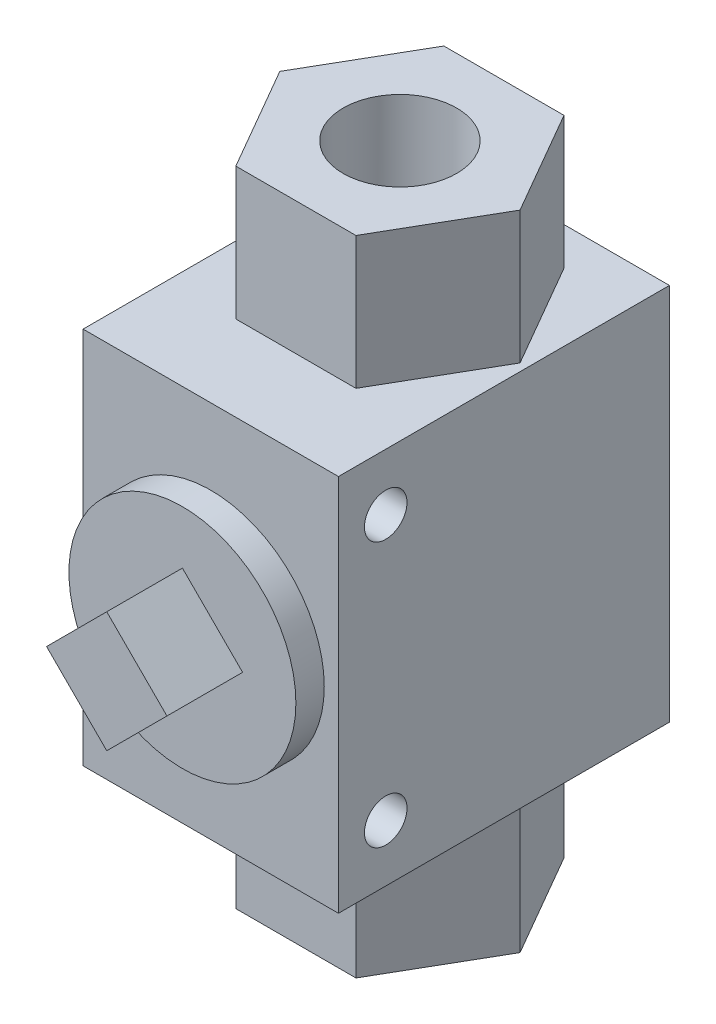
ISO-10303-21;
HEADER;
FILE_DESCRIPTION(('STEP AP214'),'2;1');
FILE_NAME('part.step','',(''),(''),'','','');
FILE_SCHEMA(('AUTOMOTIVE_DESIGN { 1 0 10303 214 1 1 1 1 }'));
ENDSEC;
DATA;
#1=APPLICATION_CONTEXT('core data for automotive mechanical design processes');
#2=APPLICATION_PROTOCOL_DEFINITION('international standard','automotive_design',2000,#1);
#3=PRODUCT_CONTEXT('',#1,'mechanical');
#4=PRODUCT('Part','Part','',(#3));
#5=PRODUCT_RELATED_PRODUCT_CATEGORY('part','',(#4));
#6=PRODUCT_DEFINITION_FORMATION('','',#4);
#7=PRODUCT_DEFINITION_CONTEXT('part definition',#1,'design');
#8=PRODUCT_DEFINITION('design','',#6,#7);
#9=PRODUCT_DEFINITION_SHAPE('','',#8);
#10=(LENGTH_UNIT() NAMED_UNIT(*) SI_UNIT(.MILLI.,.METRE.));
#11=(NAMED_UNIT(*) PLANE_ANGLE_UNIT() SI_UNIT($,.RADIAN.));
#12=(NAMED_UNIT(*) SI_UNIT($,.STERADIAN.) SOLID_ANGLE_UNIT());
#13=UNCERTAINTY_MEASURE_WITH_UNIT(LENGTH_MEASURE(1.E-05),#10,'distance_accuracy_value','');
#14=(GEOMETRIC_REPRESENTATION_CONTEXT(3) GLOBAL_UNCERTAINTY_ASSIGNED_CONTEXT((#13)) GLOBAL_UNIT_ASSIGNED_CONTEXT((#10,
#11,#12)) REPRESENTATION_CONTEXT('',''));
#15=CARTESIAN_POINT('',(0.,0.,0.));
#16=DIRECTION('',(0.,0.,1.));
#17=DIRECTION('',(1.,0.,0.));
#18=AXIS2_PLACEMENT_3D('',#15,#16,#17);
#19=CARTESIAN_POINT('',(27.,0.,0.));
#20=DIRECTION('',(-1.,0.,0.));
#21=DIRECTION('',(0.,0.,1.));
#22=AXIS2_PLACEMENT_3D('',#19,#20,#21);
#23=PLANE('',#22);
#24=DIRECTION('',(0.,0.,1.));
#25=VECTOR('',#24,1.);
#26=CARTESIAN_POINT('',(27.,20.,-17.5));
#27=LINE('',#26,#25);
#28=CARTESIAN_POINT('',(27.,20.,-17.5));
#29=VERTEX_POINT('',#28);
#30=CARTESIAN_POINT('',(27.,20.,17.5));
#31=VERTEX_POINT('',#30);
#32=EDGE_CURVE('E347',#29,#31,#27,.T.);
#33=ORIENTED_EDGE('',*,*,#32,.T.);
#34=DIRECTION('',(0.,-1.,0.));
#35=VECTOR('',#34,1.);
#36=CARTESIAN_POINT('',(27.,-20.,17.5));
#37=LINE('',#36,#35);
#38=CARTESIAN_POINT('',(27.,-20.,17.5));
#39=VERTEX_POINT('',#38);
#40=EDGE_CURVE('E351',#31,#39,#37,.T.);
#41=ORIENTED_EDGE('',*,*,#40,.T.);
#42=DIRECTION('',(0.,0.,-1.));
#43=VECTOR('',#42,1.);
#44=CARTESIAN_POINT('',(27.,-20.,-17.5));
#45=LINE('',#44,#43);
#46=CARTESIAN_POINT('',(27.,-20.,-17.5));
#47=VERTEX_POINT('',#46);
#48=EDGE_CURVE('E355',#39,#47,#45,.T.);
#49=ORIENTED_EDGE('',*,*,#48,.T.);
#50=DIRECTION('',(0.,1.,0.));
#51=VECTOR('',#50,1.);
#52=CARTESIAN_POINT('',(27.,-20.,-17.5));
#53=LINE('',#52,#51);
#54=EDGE_CURVE('E358',#47,#29,#53,.T.);
#55=ORIENTED_EDGE('',*,*,#54,.T.);
#56=EDGE_LOOP('',(#33,#41,#49,#55));
#57=FACE_BOUND('',#56,.T.);
#58=CARTESIAN_POINT('',(27.,-14.,12.5));
#59=DIRECTION('',(1.,0.,0.));
#60=DIRECTION('',(0.,0.,-1.));
#61=AXIS2_PLACEMENT_3D('',#58,#59,#60);
#62=CIRCLE('',#61,2.25);
#63=CARTESIAN_POINT('',(27.,-14.,10.25));
#64=VERTEX_POINT('',#63);
#65=EDGE_CURVE('E339',#64,#64,#62,.T.);
#66=ORIENTED_EDGE('',*,*,#65,.F.);
#67=EDGE_LOOP('',(#66));
#68=FACE_BOUND('',#67,.T.);
#69=CARTESIAN_POINT('',(27.,14.,12.5));
#70=DIRECTION('',(1.,0.,0.));
#71=DIRECTION('',(0.,0.,-1.));
#72=AXIS2_PLACEMENT_3D('',#69,#70,#71);
#73=CIRCLE('',#72,2.25);
#74=CARTESIAN_POINT('',(27.,14.,10.25));
#75=VERTEX_POINT('',#74);
#76=EDGE_CURVE('E331',#75,#75,#73,.T.);
#77=ORIENTED_EDGE('',*,*,#76,.F.);
#78=EDGE_LOOP('',(#77));
#79=FACE_BOUND('',#78,.T.);
#80=ADVANCED_FACE('F45',(#57,#68,#79),#23,.F.);
#81=CARTESIAN_POINT('',(0.,0.,0.));
#82=DIRECTION('',(-1.,0.,0.));
#83=DIRECTION('',(0.,0.,1.));
#84=AXIS2_PLACEMENT_3D('',#81,#82,#83);
#85=PLANE('',#84);
#86=CARTESIAN_POINT('',(0.,-14.,12.5));
#87=DIRECTION('',(1.,0.,0.));
#88=DIRECTION('',(0.,0.,-1.));
#89=AXIS2_PLACEMENT_3D('',#86,#87,#88);
#90=CIRCLE('',#89,2.25);
#91=CARTESIAN_POINT('',(0.,-14.,10.25));
#92=VERTEX_POINT('',#91);
#93=EDGE_CURVE('E335',#92,#92,#90,.T.);
#94=ORIENTED_EDGE('',*,*,#93,.T.);
#95=EDGE_LOOP('',(#94));
#96=FACE_BOUND('',#95,.T.);
#97=DIRECTION('',(0.,0.,1.));
#98=VECTOR('',#97,1.);
#99=CARTESIAN_POINT('',(0.,20.,-17.5));
#100=LINE('',#99,#98);
#101=CARTESIAN_POINT('',(0.,20.,-17.5));
#102=VERTEX_POINT('',#101);
#103=CARTESIAN_POINT('',(0.,20.,17.5));
#104=VERTEX_POINT('',#103);
#105=EDGE_CURVE('E343',#102,#104,#100,.T.);
#106=ORIENTED_EDGE('',*,*,#105,.F.);
#107=DIRECTION('',(0.,1.,0.));
#108=VECTOR('',#107,1.);
#109=CARTESIAN_POINT('',(0.,-20.,-17.5));
#110=LINE('',#109,#108);
#111=CARTESIAN_POINT('',(0.,-20.,-17.5));
#112=VERTEX_POINT('',#111);
#113=EDGE_CURVE('E352',#112,#102,#110,.T.);
#114=ORIENTED_EDGE('',*,*,#113,.F.);
#115=DIRECTION('',(0.,0.,-1.));
#116=VECTOR('',#115,1.);
#117=CARTESIAN_POINT('',(0.,-20.,-17.5));
#118=LINE('',#117,#116);
#119=CARTESIAN_POINT('',(0.,-20.,17.5));
#120=VERTEX_POINT('',#119);
#121=EDGE_CURVE('E368',#120,#112,#118,.T.);
#122=ORIENTED_EDGE('',*,*,#121,.F.);
#123=DIRECTION('',(0.,-1.,0.));
#124=VECTOR('',#123,1.);
#125=CARTESIAN_POINT('',(0.,-20.,17.5));
#126=LINE('',#125,#124);
#127=EDGE_CURVE('E365',#104,#120,#126,.T.);
#128=ORIENTED_EDGE('',*,*,#127,.F.);
#129=EDGE_LOOP('',(#106,#114,#122,#128));
#130=FACE_BOUND('',#129,.T.);
#131=CARTESIAN_POINT('',(0.,14.,12.5));
#132=DIRECTION('',(1.,0.,0.));
#133=DIRECTION('',(0.,0.,-1.));
#134=AXIS2_PLACEMENT_3D('',#131,#132,#133);
#135=CIRCLE('',#134,2.25);
#136=CARTESIAN_POINT('',(0.,14.,10.25));
#137=VERTEX_POINT('',#136);
#138=EDGE_CURVE('E330',#137,#137,#135,.T.);
#139=ORIENTED_EDGE('',*,*,#138,.T.);
#140=EDGE_LOOP('',(#139));
#141=FACE_BOUND('',#140,.T.);
#142=ADVANCED_FACE('F450',(#96,#130,#141),#85,.T.);
#143=CARTESIAN_POINT('',(27.,20.,-17.5));
#144=DIRECTION('',(0.,-1.,0.));
#145=DIRECTION('',(0.,0.,-1.));
#146=AXIS2_PLACEMENT_3D('',#143,#144,#145);
#147=PLANE('',#146);
#148=DIRECTION('',(-0.5,0.,-0.866025403784439));
#149=VECTOR('',#148,1.);
#150=CARTESIAN_POINT('',(0.853530029987878,20.,-2.40432852445504));
#151=LINE('',#150,#149);
#152=CARTESIAN_POINT('',(7.14914703891411,20.,8.5));
#153=VERTEX_POINT('',#152);
#154=CARTESIAN_POINT('',(0.798294077828228,20.,-2.5));
#155=VERTEX_POINT('',#154);
#156=EDGE_CURVE('E279',#153,#155,#151,.T.);
#157=ORIENTED_EDGE('',*,*,#156,.T.);
#158=DIRECTION('',(0.5,0.,-0.866025403784439));
#159=VECTOR('',#158,1.);
#160=CARTESIAN_POINT('',(13.8439110867545,20.,-25.095671475545));
#161=LINE('',#160,#159);
#162=CARTESIAN_POINT('',(7.14914703891412,20.,-13.5));
#163=VERTEX_POINT('',#162);
#164=EDGE_CURVE('E326',#155,#163,#161,.T.);
#165=ORIENTED_EDGE('',*,*,#164,.T.);
#166=DIRECTION('',(1.,0.,0.));
#167=VECTOR('',#166,1.);
#168=CARTESIAN_POINT('',(27.,20.,-13.5));
#169=LINE('',#168,#167);
#170=CARTESIAN_POINT('',(19.8508529610859,20.,-13.5));
#171=VERTEX_POINT('',#170);
#172=EDGE_CURVE('E322',#163,#171,#169,.T.);
#173=ORIENTED_EDGE('',*,*,#172,.T.);
#174=DIRECTION('',(0.5,0.,0.866025403784439));
#175=VECTOR('',#174,1.);
#176=CARTESIAN_POINT('',(19.9060889132455,20.,-13.404328524455));
#177=LINE('',#176,#175);
#178=CARTESIAN_POINT('',(26.2017059221718,20.,-2.5));
#179=VERTEX_POINT('',#178);
#180=EDGE_CURVE('E318',#171,#179,#177,.T.);
#181=ORIENTED_EDGE('',*,*,#180,.T.);
#182=DIRECTION('',(-0.5,0.,0.866025403784439));
#183=VECTOR('',#182,1.);
#184=CARTESIAN_POINT('',(32.8964699700121,20.,-14.095671475545));
#185=LINE('',#184,#183);
#186=CARTESIAN_POINT('',(19.8508529610859,20.,8.5));
#187=VERTEX_POINT('',#186);
#188=EDGE_CURVE('E314',#179,#187,#185,.T.);
#189=ORIENTED_EDGE('',*,*,#188,.T.);
#190=DIRECTION('',(-1.,0.,0.));
#191=VECTOR('',#190,1.);
#192=CARTESIAN_POINT('',(27.,20.,8.5));
#193=LINE('',#192,#191);
#194=EDGE_CURVE('E310',#187,#153,#193,.T.);
#195=ORIENTED_EDGE('',*,*,#194,.T.);
#196=EDGE_LOOP('',(#157,#165,#173,#181,#189,#195));
#197=FACE_BOUND('',#196,.T.);
#198=ORIENTED_EDGE('',*,*,#105,.T.);
#199=DIRECTION('',(-1.,0.,0.));
#200=VECTOR('',#199,1.);
#201=CARTESIAN_POINT('',(27.,20.,17.5));
#202=LINE('',#201,#200);
#203=EDGE_CURVE('E384',#31,#104,#202,.T.);
#204=ORIENTED_EDGE('',*,*,#203,.F.);
#205=ORIENTED_EDGE('',*,*,#32,.F.);
#206=DIRECTION('',(-1.,0.,0.));
#207=VECTOR('',#206,1.);
#208=CARTESIAN_POINT('',(27.,20.,-17.5));
#209=LINE('',#208,#207);
#210=EDGE_CURVE('E361',#29,#102,#209,.T.);
#211=ORIENTED_EDGE('',*,*,#210,.T.);
#212=EDGE_LOOP('',(#198,#204,#205,#211));
#213=FACE_BOUND('',#212,.T.);
#214=ADVANCED_FACE('F47',(#197,#213),#147,.F.);
#215=CARTESIAN_POINT('',(27.,-20.,17.5));
#216=DIRECTION('',(0.,0.,-1.));
#217=DIRECTION('',(-1.,0.,0.));
#218=AXIS2_PLACEMENT_3D('',#215,#216,#217);
#219=PLANE('',#218);
#220=CARTESIAN_POINT('',(13.5,0.,17.5));
#221=DIRECTION('',(0.,0.,1.));
#222=DIRECTION('',(1.,0.,0.));
#223=AXIS2_PLACEMENT_3D('',#220,#221,#222);
#224=CIRCLE('',#223,12.);
#225=CARTESIAN_POINT('',(25.5,0.,17.5));
#226=VERTEX_POINT('',#225);
#227=EDGE_CURVE('E11',#226,#226,#224,.T.);
#228=ORIENTED_EDGE('',*,*,#227,.F.);
#229=EDGE_LOOP('',(#228));
#230=FACE_BOUND('',#229,.T.);
#231=ORIENTED_EDGE('',*,*,#127,.T.);
#232=DIRECTION('',(-1.,0.,0.));
#233=VECTOR('',#232,1.);
#234=CARTESIAN_POINT('',(27.,-20.,17.5));
#235=LINE('',#234,#233);
#236=EDGE_CURVE('E380',#39,#120,#235,.T.);
#237=ORIENTED_EDGE('',*,*,#236,.F.);
#238=ORIENTED_EDGE('',*,*,#40,.F.);
#239=ORIENTED_EDGE('',*,*,#203,.T.);
#240=EDGE_LOOP('',(#231,#237,#238,#239));
#241=FACE_BOUND('',#240,.T.);
#242=ADVANCED_FACE('F468',(#230,#241),#219,.F.);
#243=CARTESIAN_POINT('',(27.,-20.,-17.5));
#244=DIRECTION('',(0.,1.,0.));
#245=DIRECTION('',(0.,0.,1.));
#246=AXIS2_PLACEMENT_3D('',#243,#244,#245);
#247=PLANE('',#246);
#248=DIRECTION('',(-1.,0.,0.));
#249=VECTOR('',#248,1.);
#250=CARTESIAN_POINT('',(27.,-20.,-13.5));
#251=LINE('',#250,#249);
#252=CARTESIAN_POINT('',(19.8508529610859,-20.,-13.5));
#253=VERTEX_POINT('',#252);
#254=CARTESIAN_POINT('',(7.14914703891412,-20.,-13.5));
#255=VERTEX_POINT('',#254);
#256=EDGE_CURVE('E407',#253,#255,#251,.T.);
#257=ORIENTED_EDGE('',*,*,#256,.T.);
#258=DIRECTION('',(-0.5,0.,0.866025403784439));
#259=VECTOR('',#258,1.);
#260=CARTESIAN_POINT('',(13.8439110867545,-20.,-25.095671475545));
#261=LINE('',#260,#259);
#262=CARTESIAN_POINT('',(0.798294077828233,-20.,-2.5));
#263=VERTEX_POINT('',#262);
#264=EDGE_CURVE('E49',#255,#263,#261,.T.);
#265=ORIENTED_EDGE('',*,*,#264,.T.);
#266=DIRECTION('',(0.5,0.,0.866025403784439));
#267=VECTOR('',#266,1.);
#268=CARTESIAN_POINT('',(0.853530029987878,-20.,-2.40432852445504));
#269=LINE('',#268,#267);
#270=CARTESIAN_POINT('',(7.14914703891411,-20.,8.5));
#271=VERTEX_POINT('',#270);
#272=EDGE_CURVE('E392',#263,#271,#269,.T.);
#273=ORIENTED_EDGE('',*,*,#272,.T.);
#274=DIRECTION('',(1.,0.,0.));
#275=VECTOR('',#274,1.);
#276=CARTESIAN_POINT('',(27.,-20.,8.5));
#277=LINE('',#276,#275);
#278=CARTESIAN_POINT('',(19.8508529610859,-20.,8.5));
#279=VERTEX_POINT('',#278);
#280=EDGE_CURVE('E396',#271,#279,#277,.T.);
#281=ORIENTED_EDGE('',*,*,#280,.T.);
#282=DIRECTION('',(0.5,0.,-0.866025403784439));
#283=VECTOR('',#282,1.);
#284=CARTESIAN_POINT('',(32.8964699700121,-20.,-14.095671475545));
#285=LINE('',#284,#283);
#286=CARTESIAN_POINT('',(26.2017059221718,-20.,-2.5));
#287=VERTEX_POINT('',#286);
#288=EDGE_CURVE('E400',#279,#287,#285,.T.);
#289=ORIENTED_EDGE('',*,*,#288,.T.);
#290=DIRECTION('',(-0.5,0.,-0.866025403784439));
#291=VECTOR('',#290,1.);
#292=CARTESIAN_POINT('',(19.9060889132455,-20.,-13.404328524455));
#293=LINE('',#292,#291);
#294=EDGE_CURVE('E404',#287,#253,#293,.T.);
#295=ORIENTED_EDGE('',*,*,#294,.T.);
#296=EDGE_LOOP('',(#257,#265,#273,#281,#289,#295));
#297=FACE_BOUND('',#296,.T.);
#298=ORIENTED_EDGE('',*,*,#121,.T.);
#299=DIRECTION('',(-1.,0.,0.));
#300=VECTOR('',#299,1.);
#301=CARTESIAN_POINT('',(27.,-20.,-17.5));
#302=LINE('',#301,#300);
#303=EDGE_CURVE('E376',#47,#112,#302,.T.);
#304=ORIENTED_EDGE('',*,*,#303,.F.);
#305=ORIENTED_EDGE('',*,*,#48,.F.);
#306=ORIENTED_EDGE('',*,*,#236,.T.);
#307=EDGE_LOOP('',(#298,#304,#305,#306));
#308=FACE_BOUND('',#307,.T.);
#309=ADVANCED_FACE('F413',(#297,#308),#247,.F.);
#310=CARTESIAN_POINT('',(27.,-20.,-17.5));
#311=DIRECTION('',(0.,0.,1.));
#312=DIRECTION('',(1.,0.,0.));
#313=AXIS2_PLACEMENT_3D('',#310,#311,#312);
#314=PLANE('',#313);
#315=ORIENTED_EDGE('',*,*,#113,.T.);
#316=ORIENTED_EDGE('',*,*,#210,.F.);
#317=ORIENTED_EDGE('',*,*,#54,.F.);
#318=ORIENTED_EDGE('',*,*,#303,.T.);
#319=EDGE_LOOP('',(#315,#316,#317,#318));
#320=FACE_BOUND('',#319,.T.);
#321=ADVANCED_FACE('F463',(#320),#314,.F.);
#322=CARTESIAN_POINT('',(27.,-14.,12.5));
#323=DIRECTION('',(-1.,0.,0.));
#324=DIRECTION('',(0.,0.,1.));
#325=AXIS2_PLACEMENT_3D('',#322,#323,#324);
#326=CYLINDRICAL_SURFACE('',#325,2.25);
#327=ORIENTED_EDGE('',*,*,#65,.T.);
#328=EDGE_LOOP('',(#327));
#329=FACE_BOUND('',#328,.T.);
#330=ORIENTED_EDGE('',*,*,#93,.F.);
#331=EDGE_LOOP('',(#330));
#332=FACE_BOUND('',#331,.T.);
#333=ADVANCED_FACE('F460',(#329,#332),#326,.F.);
#334=CARTESIAN_POINT('',(27.,14.,12.5));
#335=DIRECTION('',(-1.,0.,0.));
#336=DIRECTION('',(0.,0.,1.));
#337=AXIS2_PLACEMENT_3D('',#334,#335,#336);
#338=CYLINDRICAL_SURFACE('',#337,2.25);
#339=ORIENTED_EDGE('',*,*,#76,.T.);
#340=EDGE_LOOP('',(#339));
#341=FACE_BOUND('',#340,.T.);
#342=ORIENTED_EDGE('',*,*,#138,.F.);
#343=EDGE_LOOP('',(#342));
#344=FACE_BOUND('',#343,.T.);
#345=ADVANCED_FACE('F496',(#341,#344),#338,.F.);
#346=CARTESIAN_POINT('',(0.798294077828233,-34.,-2.5));
#347=DIRECTION('',(-0.866025403784439,0.,0.5));
#348=DIRECTION('',(0.5,0.,0.866025403784439));
#349=AXIS2_PLACEMENT_3D('',#346,#347,#348);
#350=PLANE('',#349);
#351=ORIENTED_EDGE('',*,*,#272,.F.);
#352=DIRECTION('',(0.,1.,0.));
#353=VECTOR('',#352,1.);
#354=CARTESIAN_POINT('',(0.798294077828233,-34.,-2.5));
#355=LINE('',#354,#353);
#356=CARTESIAN_POINT('',(0.798294077828233,-34.,-2.5));
#357=VERTEX_POINT('',#356);
#358=EDGE_CURVE('E300',#357,#263,#355,.T.);
#359=ORIENTED_EDGE('',*,*,#358,.F.);
#360=DIRECTION('',(0.5,0.,0.866025403784439));
#361=VECTOR('',#360,1.);
#362=CARTESIAN_POINT('',(0.798294077828233,-34.,-2.5));
#363=LINE('',#362,#361);
#364=CARTESIAN_POINT('',(7.14914703891411,-34.,8.5));
#365=VERTEX_POINT('',#364);
#366=EDGE_CURVE('E254',#357,#365,#363,.T.);
#367=ORIENTED_EDGE('',*,*,#366,.T.);
#368=DIRECTION('',(0.,1.,0.));
#369=VECTOR('',#368,1.);
#370=CARTESIAN_POINT('',(7.14914703891411,-34.,8.5));
#371=LINE('',#370,#369);
#372=EDGE_CURVE('E296',#365,#271,#371,.T.);
#373=ORIENTED_EDGE('',*,*,#372,.T.);
#374=EDGE_LOOP('',(#351,#359,#367,#373));
#375=FACE_BOUND('',#374,.T.);
#376=ADVANCED_FACE('F428',(#375),#350,.T.);
#377=CARTESIAN_POINT('',(7.14914703891411,-34.,8.5));
#378=DIRECTION('',(0.,0.,1.));
#379=DIRECTION('',(1.,0.,0.));
#380=AXIS2_PLACEMENT_3D('',#377,#378,#379);
#381=PLANE('',#380);
#382=ORIENTED_EDGE('',*,*,#280,.F.);
#383=ORIENTED_EDGE('',*,*,#372,.F.);
#384=DIRECTION('',(1.,0.,0.));
#385=VECTOR('',#384,1.);
#386=CARTESIAN_POINT('',(7.14914703891411,-34.,8.5));
#387=LINE('',#386,#385);
#388=CARTESIAN_POINT('',(19.8508529610859,-34.,8.5));
#389=VERTEX_POINT('',#388);
#390=EDGE_CURVE('E258',#365,#389,#387,.T.);
#391=ORIENTED_EDGE('',*,*,#390,.T.);
#392=DIRECTION('',(0.,1.,0.));
#393=VECTOR('',#392,1.);
#394=CARTESIAN_POINT('',(19.8508529610859,-34.,8.5));
#395=LINE('',#394,#393);
#396=EDGE_CURVE('E291',#389,#279,#395,.T.);
#397=ORIENTED_EDGE('',*,*,#396,.T.);
#398=EDGE_LOOP('',(#382,#383,#391,#397));
#399=FACE_BOUND('',#398,.T.);
#400=ADVANCED_FACE('F431',(#399),#381,.T.);
#401=CARTESIAN_POINT('',(19.8508529610859,-34.,8.5));
#402=DIRECTION('',(0.866025403784439,0.,0.5));
#403=DIRECTION('',(0.5,0.,-0.866025403784439));
#404=AXIS2_PLACEMENT_3D('',#401,#402,#403);
#405=PLANE('',#404);
#406=ORIENTED_EDGE('',*,*,#288,.F.);
#407=ORIENTED_EDGE('',*,*,#396,.F.);
#408=DIRECTION('',(0.5,0.,-0.866025403784439));
#409=VECTOR('',#408,1.);
#410=CARTESIAN_POINT('',(19.8508529610859,-34.,8.5));
#411=LINE('',#410,#409);
#412=CARTESIAN_POINT('',(26.2017059221718,-34.,-2.5));
#413=VERTEX_POINT('',#412);
#414=EDGE_CURVE('E262',#389,#413,#411,.T.);
#415=ORIENTED_EDGE('',*,*,#414,.T.);
#416=DIRECTION('',(0.,1.,0.));
#417=VECTOR('',#416,1.);
#418=CARTESIAN_POINT('',(26.2017059221718,-34.,-2.5));
#419=LINE('',#418,#417);
#420=EDGE_CURVE('E286',#413,#287,#419,.T.);
#421=ORIENTED_EDGE('',*,*,#420,.T.);
#422=EDGE_LOOP('',(#406,#407,#415,#421));
#423=FACE_BOUND('',#422,.T.);
#424=ADVANCED_FACE('F433',(#423),#405,.T.);
#425=CARTESIAN_POINT('',(26.2017059221718,-34.,-2.5));
#426=DIRECTION('',(0.866025403784439,0.,-0.5));
#427=DIRECTION('',(-0.5,0.,-0.866025403784439));
#428=AXIS2_PLACEMENT_3D('',#425,#426,#427);
#429=PLANE('',#428);
#430=ORIENTED_EDGE('',*,*,#294,.F.);
#431=ORIENTED_EDGE('',*,*,#420,.F.);
#432=DIRECTION('',(-0.5,0.,-0.866025403784439));
#433=VECTOR('',#432,1.);
#434=CARTESIAN_POINT('',(26.2017059221718,-34.,-2.5));
#435=LINE('',#434,#433);
#436=CARTESIAN_POINT('',(19.8508529610859,-34.,-13.5));
#437=VERTEX_POINT('',#436);
#438=EDGE_CURVE('E266',#413,#437,#435,.T.);
#439=ORIENTED_EDGE('',*,*,#438,.T.);
#440=DIRECTION('',(0.,1.,0.));
#441=VECTOR('',#440,1.);
#442=CARTESIAN_POINT('',(19.8508529610859,-34.,-13.5));
#443=LINE('',#442,#441);
#444=EDGE_CURVE('E281',#437,#253,#443,.T.);
#445=ORIENTED_EDGE('',*,*,#444,.T.);
#446=EDGE_LOOP('',(#430,#431,#439,#445));
#447=FACE_BOUND('',#446,.T.);
#448=ADVANCED_FACE('F435',(#447),#429,.T.);
#449=CARTESIAN_POINT('',(19.8508529610859,-34.,-13.5));
#450=DIRECTION('',(0.,0.,-1.));
#451=DIRECTION('',(-1.,0.,0.));
#452=AXIS2_PLACEMENT_3D('',#449,#450,#451);
#453=PLANE('',#452);
#454=ORIENTED_EDGE('',*,*,#256,.F.);
#455=ORIENTED_EDGE('',*,*,#444,.F.);
#456=DIRECTION('',(-1.,0.,0.));
#457=VECTOR('',#456,1.);
#458=CARTESIAN_POINT('',(19.8508529610859,-34.,-13.5));
#459=LINE('',#458,#457);
#460=CARTESIAN_POINT('',(7.14914703891412,-34.,-13.5));
#461=VERTEX_POINT('',#460);
#462=EDGE_CURVE('E270',#437,#461,#459,.T.);
#463=ORIENTED_EDGE('',*,*,#462,.T.);
#464=DIRECTION('',(0.,1.,0.));
#465=VECTOR('',#464,1.);
#466=CARTESIAN_POINT('',(7.14914703891412,-34.,-13.5));
#467=LINE('',#466,#465);
#468=EDGE_CURVE('E275',#461,#255,#467,.T.);
#469=ORIENTED_EDGE('',*,*,#468,.T.);
#470=EDGE_LOOP('',(#454,#455,#463,#469));
#471=FACE_BOUND('',#470,.T.);
#472=ADVANCED_FACE('F419',(#471),#453,.T.);
#473=CARTESIAN_POINT('',(7.14914703891412,-34.,-13.5));
#474=DIRECTION('',(-0.866025403784439,0.,-0.5));
#475=DIRECTION('',(-0.5,0.,0.866025403784439));
#476=AXIS2_PLACEMENT_3D('',#473,#474,#475);
#477=PLANE('',#476);
#478=ORIENTED_EDGE('',*,*,#264,.F.);
#479=ORIENTED_EDGE('',*,*,#468,.F.);
#480=DIRECTION('',(-0.5,0.,0.866025403784439));
#481=VECTOR('',#480,1.);
#482=CARTESIAN_POINT('',(7.14914703891412,-34.,-13.5));
#483=LINE('',#482,#481);
#484=EDGE_CURVE('E250',#461,#357,#483,.T.);
#485=ORIENTED_EDGE('',*,*,#484,.T.);
#486=ORIENTED_EDGE('',*,*,#358,.T.);
#487=EDGE_LOOP('',(#478,#479,#485,#486));
#488=FACE_BOUND('',#487,.T.);
#489=ADVANCED_FACE('F416',(#488),#477,.T.);
#490=CARTESIAN_POINT('',(0.,-34.,0.));
#491=DIRECTION('',(0.,1.,0.));
#492=DIRECTION('',(0.,0.,1.));
#493=AXIS2_PLACEMENT_3D('',#490,#491,#492);
#494=PLANE('',#493);
#495=CARTESIAN_POINT('',(13.5,-34.,-2.5));
#496=DIRECTION('',(0.,1.,0.));
#497=DIRECTION('',(0.,0.,1.));
#498=AXIS2_PLACEMENT_3D('',#495,#496,#497);
#499=CIRCLE('',#498,6.);
#500=CARTESIAN_POINT('',(13.5,-34.,3.5));
#501=VERTEX_POINT('',#500);
#502=EDGE_CURVE('E246',#501,#501,#499,.T.);
#503=ORIENTED_EDGE('',*,*,#502,.T.);
#504=EDGE_LOOP('',(#503));
#505=FACE_BOUND('',#504,.T.);
#506=ORIENTED_EDGE('',*,*,#484,.F.);
#507=ORIENTED_EDGE('',*,*,#462,.F.);
#508=ORIENTED_EDGE('',*,*,#438,.F.);
#509=ORIENTED_EDGE('',*,*,#414,.F.);
#510=ORIENTED_EDGE('',*,*,#390,.F.);
#511=ORIENTED_EDGE('',*,*,#366,.F.);
#512=EDGE_LOOP('',(#506,#507,#508,#509,#510,#511));
#513=FACE_BOUND('',#512,.T.);
#514=ADVANCED_FACE('F423',(#505,#513),#494,.F.);
#515=CARTESIAN_POINT('',(13.5,-34.,-2.5));
#516=DIRECTION('',(0.,1.,0.));
#517=DIRECTION('',(0.,0.,1.));
#518=AXIS2_PLACEMENT_3D('',#515,#516,#517);
#519=CYLINDRICAL_SURFACE('',#518,6.);
#520=ORIENTED_EDGE('',*,*,#502,.F.);
#521=EDGE_LOOP('',(#520));
#522=FACE_BOUND('',#521,.T.);
#523=CARTESIAN_POINT('',(13.5,-20.,-2.5));
#524=DIRECTION('',(0.,1.,0.));
#525=DIRECTION('',(0.,0.,1.));
#526=AXIS2_PLACEMENT_3D('',#523,#524,#525);
#527=CIRCLE('',#526,6.);
#528=CARTESIAN_POINT('',(13.5,-20.,3.5));
#529=VERTEX_POINT('',#528);
#530=EDGE_CURVE('E388',#529,#529,#527,.T.);
#531=ORIENTED_EDGE('',*,*,#530,.T.);
#532=EDGE_LOOP('',(#531));
#533=FACE_BOUND('',#532,.T.);
#534=ADVANCED_FACE('F550',(#522,#533),#519,.F.);
#535=ORIENTED_EDGE('',*,*,#530,.F.);
#536=EDGE_LOOP('',(#535));
#537=FACE_BOUND('',#536,.T.);
#538=ADVANCED_FACE('F469',(#537),#247,.F.);
#539=ORIENTED_EDGE('',*,*,#164,.F.);
#540=CARTESIAN_POINT('',(0.798294077828233,34.,-2.5));
#541=VERTEX_POINT('',#540);
#542=EDGE_CURVE('E274',#155,#541,#355,.T.);
#543=ORIENTED_EDGE('',*,*,#542,.T.);
#544=DIRECTION('',(-0.5,0.,0.866025403784439));
#545=VECTOR('',#544,1.);
#546=CARTESIAN_POINT('',(7.14914703891412,34.,-13.5));
#547=LINE('',#546,#545);
#548=CARTESIAN_POINT('',(7.14914703891412,34.,-13.5));
#549=VERTEX_POINT('',#548);
#550=EDGE_CURVE('E222',#549,#541,#547,.T.);
#551=ORIENTED_EDGE('',*,*,#550,.F.);
#552=EDGE_CURVE('E280',#163,#549,#467,.T.);
#553=ORIENTED_EDGE('',*,*,#552,.F.);
#554=EDGE_LOOP('',(#539,#543,#551,#553));
#555=FACE_BOUND('',#554,.T.);
#556=ADVANCED_FACE('F507',(#555),#477,.T.);
#557=ORIENTED_EDGE('',*,*,#172,.F.);
#558=ORIENTED_EDGE('',*,*,#552,.T.);
#559=DIRECTION('',(-1.,0.,0.));
#560=VECTOR('',#559,1.);
#561=CARTESIAN_POINT('',(19.8508529610859,34.,-13.5));
#562=LINE('',#561,#560);
#563=CARTESIAN_POINT('',(19.8508529610859,34.,-13.5));
#564=VERTEX_POINT('',#563);
#565=EDGE_CURVE('E242',#564,#549,#562,.T.);
#566=ORIENTED_EDGE('',*,*,#565,.F.);
#567=EDGE_CURVE('E285',#171,#564,#443,.T.);
#568=ORIENTED_EDGE('',*,*,#567,.F.);
#569=EDGE_LOOP('',(#557,#558,#566,#568));
#570=FACE_BOUND('',#569,.T.);
#571=ADVANCED_FACE('F444',(#570),#453,.T.);
#572=ORIENTED_EDGE('',*,*,#180,.F.);
#573=ORIENTED_EDGE('',*,*,#567,.T.);
#574=DIRECTION('',(-0.5,0.,-0.866025403784439));
#575=VECTOR('',#574,1.);
#576=CARTESIAN_POINT('',(26.2017059221718,34.,-2.5));
#577=LINE('',#576,#575);
#578=CARTESIAN_POINT('',(26.2017059221718,34.,-2.5));
#579=VERTEX_POINT('',#578);
#580=EDGE_CURVE('E238',#579,#564,#577,.T.);
#581=ORIENTED_EDGE('',*,*,#580,.F.);
#582=EDGE_CURVE('E290',#179,#579,#419,.T.);
#583=ORIENTED_EDGE('',*,*,#582,.F.);
#584=EDGE_LOOP('',(#572,#573,#581,#583));
#585=FACE_BOUND('',#584,.T.);
#586=ADVANCED_FACE('F438',(#585),#429,.T.);
#587=ORIENTED_EDGE('',*,*,#188,.F.);
#588=ORIENTED_EDGE('',*,*,#582,.T.);
#589=DIRECTION('',(0.5,0.,-0.866025403784439));
#590=VECTOR('',#589,1.);
#591=CARTESIAN_POINT('',(19.8508529610859,34.,8.5));
#592=LINE('',#591,#590);
#593=CARTESIAN_POINT('',(19.8508529610859,34.,8.5));
#594=VERTEX_POINT('',#593);
#595=EDGE_CURVE('E234',#594,#579,#592,.T.);
#596=ORIENTED_EDGE('',*,*,#595,.F.);
#597=EDGE_CURVE('E295',#187,#594,#395,.T.);
#598=ORIENTED_EDGE('',*,*,#597,.F.);
#599=EDGE_LOOP('',(#587,#588,#596,#598));
#600=FACE_BOUND('',#599,.T.);
#601=ADVANCED_FACE('F446',(#600),#405,.T.);
#602=ORIENTED_EDGE('',*,*,#194,.F.);
#603=ORIENTED_EDGE('',*,*,#597,.T.);
#604=DIRECTION('',(1.,0.,0.));
#605=VECTOR('',#604,1.);
#606=CARTESIAN_POINT('',(7.14914703891411,34.,8.5));
#607=LINE('',#606,#605);
#608=CARTESIAN_POINT('',(7.14914703891411,34.,8.5));
#609=VERTEX_POINT('',#608);
#610=EDGE_CURVE('E230',#609,#594,#607,.T.);
#611=ORIENTED_EDGE('',*,*,#610,.F.);
#612=EDGE_CURVE('E299',#153,#609,#371,.T.);
#613=ORIENTED_EDGE('',*,*,#612,.F.);
#614=EDGE_LOOP('',(#602,#603,#611,#613));
#615=FACE_BOUND('',#614,.T.);
#616=ADVANCED_FACE('F513',(#615),#381,.T.);
#617=ORIENTED_EDGE('',*,*,#156,.F.);
#618=ORIENTED_EDGE('',*,*,#612,.T.);
#619=DIRECTION('',(0.5,0.,0.866025403784439));
#620=VECTOR('',#619,1.);
#621=CARTESIAN_POINT('',(0.798294077828233,34.,-2.5));
#622=LINE('',#621,#620);
#623=EDGE_CURVE('E226',#541,#609,#622,.T.);
#624=ORIENTED_EDGE('',*,*,#623,.F.);
#625=ORIENTED_EDGE('',*,*,#542,.F.);
#626=EDGE_LOOP('',(#617,#618,#624,#625));
#627=FACE_BOUND('',#626,.T.);
#628=ADVANCED_FACE('F504',(#627),#350,.T.);
#629=CARTESIAN_POINT('',(13.5,34.,-2.5));
#630=DIRECTION('',(0.,1.,0.));
#631=DIRECTION('',(0.,0.,1.));
#632=AXIS2_PLACEMENT_3D('',#629,#630,#631);
#633=CIRCLE('',#632,6.);
#634=CARTESIAN_POINT('',(13.5,34.,3.5));
#635=VERTEX_POINT('',#634);
#636=EDGE_CURVE('E213',#635,#635,#633,.T.);
#637=ORIENTED_EDGE('',*,*,#636,.T.);
#638=EDGE_LOOP('',(#637));
#639=FACE_BOUND('',#638,.T.);
#640=CARTESIAN_POINT('',(13.5,20.,-2.5));
#641=DIRECTION('',(0.,-1.,0.));
#642=DIRECTION('',(0.,0.,-1.));
#643=AXIS2_PLACEMENT_3D('',#640,#641,#642);
#644=CIRCLE('',#643,6.);
#645=CARTESIAN_POINT('',(13.5,20.,-8.5));
#646=VERTEX_POINT('',#645);
#647=EDGE_CURVE('E55',#646,#646,#644,.T.);
#648=ORIENTED_EDGE('',*,*,#647,.T.);
#649=EDGE_LOOP('',(#648));
#650=FACE_BOUND('',#649,.T.);
#651=ADVANCED_FACE('F512',(#639,#650),#519,.F.);
#652=CARTESIAN_POINT('',(0.,34.,0.));
#653=DIRECTION('',(0.,1.,0.));
#654=DIRECTION('',(0.,0.,1.));
#655=AXIS2_PLACEMENT_3D('',#652,#653,#654);
#656=PLANE('',#655);
#657=ORIENTED_EDGE('',*,*,#550,.T.);
#658=ORIENTED_EDGE('',*,*,#623,.T.);
#659=ORIENTED_EDGE('',*,*,#610,.T.);
#660=ORIENTED_EDGE('',*,*,#595,.T.);
#661=ORIENTED_EDGE('',*,*,#580,.T.);
#662=ORIENTED_EDGE('',*,*,#565,.T.);
#663=EDGE_LOOP('',(#657,#658,#659,#660,#661,#662));
#664=FACE_BOUND('',#663,.T.);
#665=ORIENTED_EDGE('',*,*,#636,.F.);
#666=EDGE_LOOP('',(#665));
#667=FACE_BOUND('',#666,.T.);
#668=ADVANCED_FACE('F541',(#664,#667),#656,.T.);
#669=ORIENTED_EDGE('',*,*,#647,.F.);
#670=EDGE_LOOP('',(#669));
#671=FACE_BOUND('',#670,.T.);
#672=ADVANCED_FACE('F478',(#671),#147,.F.);
#673=CARTESIAN_POINT('',(13.5,0.,20.5));
#674=DIRECTION('',(0.,0.,-1.));
#675=DIRECTION('',(-1.,0.,0.));
#676=AXIS2_PLACEMENT_3D('',#673,#674,#675);
#677=CYLINDRICAL_SURFACE('',#676,12.);
#678=CARTESIAN_POINT('',(13.5,0.,20.5));
#679=DIRECTION('',(0.,0.,1.));
#680=DIRECTION('',(1.,0.,0.));
#681=AXIS2_PLACEMENT_3D('',#678,#679,#680);
#682=CIRCLE('',#681,12.);
#683=CARTESIAN_POINT('',(25.5,0.,20.5));
#684=VERTEX_POINT('',#683);
#685=EDGE_CURVE('E208',#684,#684,#682,.T.);
#686=ORIENTED_EDGE('',*,*,#685,.F.);
#687=EDGE_LOOP('',(#686));
#688=FACE_BOUND('',#687,.T.);
#689=ORIENTED_EDGE('',*,*,#227,.T.);
#690=EDGE_LOOP('',(#689));
#691=FACE_BOUND('',#690,.T.);
#692=ADVANCED_FACE('F553',(#688,#691),#677,.T.);
#693=CARTESIAN_POINT('',(13.5,0.,20.5));
#694=DIRECTION('',(0.,0.,1.));
#695=DIRECTION('',(1.,0.,0.));
#696=AXIS2_PLACEMENT_3D('',#693,#694,#695);
#697=PLANE('',#696);
#698=DIRECTION('',(-0.707106781186548,0.707106781186547,0.));
#699=VECTOR('',#698,1.);
#700=CARTESIAN_POINT('',(19.8639610306789,0.,20.5));
#701=LINE('',#700,#699);
#702=CARTESIAN_POINT('',(19.8639610306789,0.,20.5));
#703=VERTEX_POINT('',#702);
#704=CARTESIAN_POINT('',(13.5,6.36396103067893,20.5));
#705=VERTEX_POINT('',#704);
#706=EDGE_CURVE('E63',#703,#705,#701,.T.);
#707=ORIENTED_EDGE('',*,*,#706,.F.);
#708=DIRECTION('',(0.707106781186548,0.707106781186548,0.));
#709=VECTOR('',#708,1.);
#710=CARTESIAN_POINT('',(13.5,-6.36396103067893,20.5));
#711=LINE('',#710,#709);
#712=CARTESIAN_POINT('',(13.5,-6.36396103067893,20.5));
#713=VERTEX_POINT('',#712);
#714=EDGE_CURVE('E67',#713,#703,#711,.T.);
#715=ORIENTED_EDGE('',*,*,#714,.F.);
#716=DIRECTION('',(0.707106781186548,-0.707106781186547,0.));
#717=VECTOR('',#716,1.);
#718=CARTESIAN_POINT('',(7.13603896932107,0.,20.5));
#719=LINE('',#718,#717);
#720=CARTESIAN_POINT('',(7.13603896932107,0.,20.5));
#721=VERTEX_POINT('',#720);
#722=EDGE_CURVE('E669',#721,#713,#719,.T.);
#723=ORIENTED_EDGE('',*,*,#722,.F.);
#724=DIRECTION('',(-0.707106781186548,-0.707106781186548,0.));
#725=VECTOR('',#724,1.);
#726=CARTESIAN_POINT('',(13.5,6.36396103067893,20.5));
#727=LINE('',#726,#725);
#728=EDGE_CURVE('E679',#705,#721,#727,.T.);
#729=ORIENTED_EDGE('',*,*,#728,.F.);
#730=EDGE_LOOP('',(#707,#715,#723,#729));
#731=FACE_BOUND('',#730,.T.);
#732=ORIENTED_EDGE('',*,*,#685,.T.);
#733=EDGE_LOOP('',(#732));
#734=FACE_BOUND('',#733,.T.);
#735=ADVANCED_FACE('F556',(#731,#734),#697,.T.);
#736=CARTESIAN_POINT('',(19.8639610306789,0.,28.5));
#737=DIRECTION('',(-0.707106781186547,-0.707106781186548,0.));
#738=DIRECTION('',(0.707106781186548,-0.707106781186547,0.));
#739=AXIS2_PLACEMENT_3D('',#736,#737,#738);
#740=PLANE('',#739);
#741=ORIENTED_EDGE('',*,*,#706,.T.);
#742=DIRECTION('',(0.,0.,-1.));
#743=VECTOR('',#742,1.);
#744=CARTESIAN_POINT('',(13.5,6.36396103067893,28.5));
#745=LINE('',#744,#743);
#746=CARTESIAN_POINT('',(13.5,6.36396103067893,28.5));
#747=VERTEX_POINT('',#746);
#748=EDGE_CURVE('E188',#747,#705,#745,.T.);
#749=ORIENTED_EDGE('',*,*,#748,.F.);
#750=DIRECTION('',(-0.707106781186548,0.707106781186547,0.));
#751=VECTOR('',#750,1.);
#752=CARTESIAN_POINT('',(19.8639610306789,0.,28.5));
#753=LINE('',#752,#751);
#754=CARTESIAN_POINT('',(19.8639610306789,0.,28.5));
#755=VERTEX_POINT('',#754);
#756=EDGE_CURVE('E195',#755,#747,#753,.T.);
#757=ORIENTED_EDGE('',*,*,#756,.F.);
#758=DIRECTION('',(0.,0.,-1.));
#759=VECTOR('',#758,1.);
#760=CARTESIAN_POINT('',(19.8639610306789,0.,28.5));
#761=LINE('',#760,#759);
#762=EDGE_CURVE('E666',#755,#703,#761,.T.);
#763=ORIENTED_EDGE('',*,*,#762,.T.);
#764=EDGE_LOOP('',(#741,#749,#757,#763));
#765=FACE_BOUND('',#764,.T.);
#766=ADVANCED_FACE('F206',(#765),#740,.F.);
#767=CARTESIAN_POINT('',(13.5,6.36396103067893,28.5));
#768=DIRECTION('',(0.707106781186547,-0.707106781186548,0.));
#769=DIRECTION('',(0.707106781186548,0.707106781186547,0.));
#770=AXIS2_PLACEMENT_3D('',#767,#768,#769);
#771=PLANE('',#770);
#772=ORIENTED_EDGE('',*,*,#728,.T.);
#773=DIRECTION('',(0.,0.,-1.));
#774=VECTOR('',#773,1.);
#775=CARTESIAN_POINT('',(7.13603896932107,0.,28.5));
#776=LINE('',#775,#774);
#777=CARTESIAN_POINT('',(7.13603896932107,0.,28.5));
#778=VERTEX_POINT('',#777);
#779=EDGE_CURVE('E190',#778,#721,#776,.T.);
#780=ORIENTED_EDGE('',*,*,#779,.F.);
#781=DIRECTION('',(-0.707106781186548,-0.707106781186548,0.));
#782=VECTOR('',#781,1.);
#783=CARTESIAN_POINT('',(13.5,6.36396103067893,28.5));
#784=LINE('',#783,#782);
#785=EDGE_CURVE('E183',#747,#778,#784,.T.);
#786=ORIENTED_EDGE('',*,*,#785,.F.);
#787=ORIENTED_EDGE('',*,*,#748,.T.);
#788=EDGE_LOOP('',(#772,#780,#786,#787));
#789=FACE_BOUND('',#788,.T.);
#790=ADVANCED_FACE('F186',(#789),#771,.F.);
#791=CARTESIAN_POINT('',(7.13603896932107,0.,28.5));
#792=DIRECTION('',(0.707106781186547,0.707106781186548,0.));
#793=DIRECTION('',(-0.707106781186548,0.707106781186547,0.));
#794=AXIS2_PLACEMENT_3D('',#791,#792,#793);
#795=PLANE('',#794);
#796=ORIENTED_EDGE('',*,*,#722,.T.);
#797=DIRECTION('',(0.,0.,-1.));
#798=VECTOR('',#797,1.);
#799=CARTESIAN_POINT('',(13.5,-6.36396103067893,28.5));
#800=LINE('',#799,#798);
#801=CARTESIAN_POINT('',(13.5,-6.36396103067893,28.5));
#802=VERTEX_POINT('',#801);
#803=EDGE_CURVE('E215',#802,#713,#800,.T.);
#804=ORIENTED_EDGE('',*,*,#803,.F.);
#805=DIRECTION('',(0.707106781186548,-0.707106781186547,0.));
#806=VECTOR('',#805,1.);
#807=CARTESIAN_POINT('',(7.13603896932107,0.,28.5));
#808=LINE('',#807,#806);
#809=EDGE_CURVE('E194',#778,#802,#808,.T.);
#810=ORIENTED_EDGE('',*,*,#809,.F.);
#811=ORIENTED_EDGE('',*,*,#779,.T.);
#812=EDGE_LOOP('',(#796,#804,#810,#811));
#813=FACE_BOUND('',#812,.T.);
#814=ADVANCED_FACE('F635',(#813),#795,.F.);
#815=CARTESIAN_POINT('',(13.5,-6.36396103067893,28.5));
#816=DIRECTION('',(-0.707106781186547,0.707106781186547,0.));
#817=DIRECTION('',(-0.707106781186548,-0.707106781186548,0.));
#818=AXIS2_PLACEMENT_3D('',#815,#816,#817);
#819=PLANE('',#818);
#820=ORIENTED_EDGE('',*,*,#714,.T.);
#821=ORIENTED_EDGE('',*,*,#762,.F.);
#822=DIRECTION('',(0.707106781186548,0.707106781186548,0.));
#823=VECTOR('',#822,1.);
#824=CARTESIAN_POINT('',(13.5,-6.36396103067893,28.5));
#825=LINE('',#824,#823);
#826=EDGE_CURVE('E200',#802,#755,#825,.T.);
#827=ORIENTED_EDGE('',*,*,#826,.F.);
#828=ORIENTED_EDGE('',*,*,#803,.T.);
#829=EDGE_LOOP('',(#820,#821,#827,#828));
#830=FACE_BOUND('',#829,.T.);
#831=ADVANCED_FACE('F644',(#830),#819,.F.);
#832=CARTESIAN_POINT('',(0.,0.,28.5));
#833=DIRECTION('',(0.,0.,1.));
#834=DIRECTION('',(1.,0.,0.));
#835=AXIS2_PLACEMENT_3D('',#832,#833,#834);
#836=PLANE('',#835);
#837=ORIENTED_EDGE('',*,*,#756,.T.);
#838=ORIENTED_EDGE('',*,*,#785,.T.);
#839=ORIENTED_EDGE('',*,*,#809,.T.);
#840=ORIENTED_EDGE('',*,*,#826,.T.);
#841=EDGE_LOOP('',(#837,#838,#839,#840));
#842=FACE_BOUND('',#841,.T.);
#843=ADVANCED_FACE('F198',(#842),#836,.T.);
#844=CLOSED_SHELL('',(#80,#142,#214,#242,#309,#321,#333,#345,#376,#400,#424,#448,#472,#489,#514,
#534,#538,#556,#571,#586,#601,#616,#628,#651,#668,#672,#692,#735,#766,#790,#814,#831,#843));
#845=MANIFOLD_SOLID_BREP('B2',#844);
#846=ADVANCED_BREP_SHAPE_REPRESENTATION('',(#18,#845),#14);
#847=SHAPE_DEFINITION_REPRESENTATION(#9,#846);
ENDSEC;
END-ISO-10303-21;
